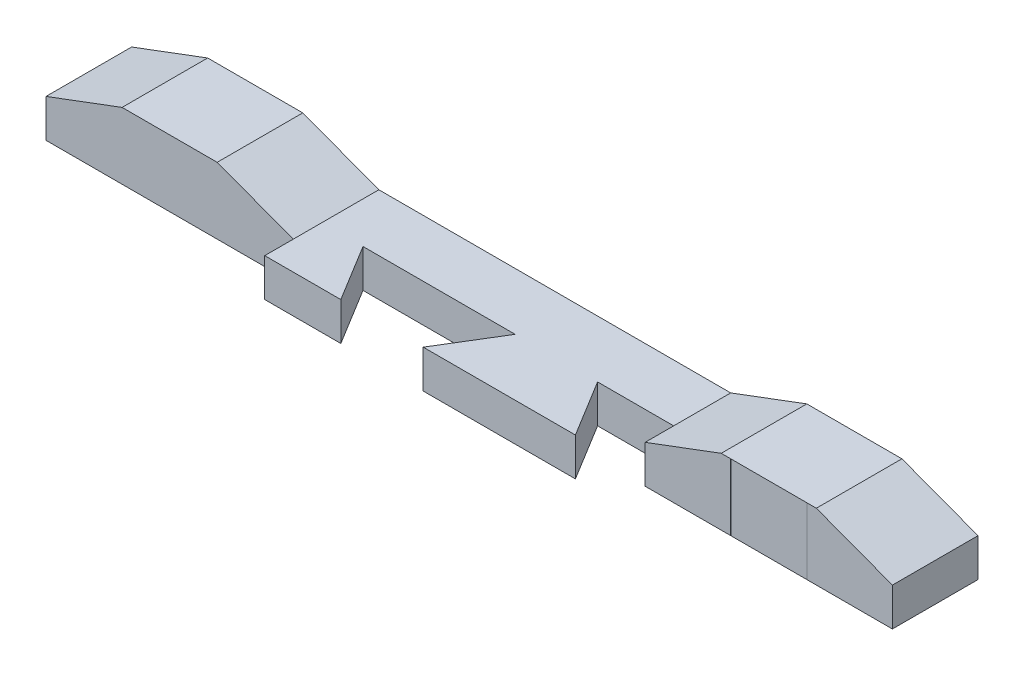
ISO-10303-21;
HEADER;
FILE_DESCRIPTION(('STEP AP214'),'2;1');
FILE_NAME('part.step','',(''),(''),'','','');
FILE_SCHEMA(('AUTOMOTIVE_DESIGN { 1 0 10303 214 1 1 1 1 }'));
ENDSEC;
DATA;
#1=APPLICATION_CONTEXT('core data for automotive mechanical design processes');
#2=APPLICATION_PROTOCOL_DEFINITION('international standard','automotive_design',2000,#1);
#3=PRODUCT_CONTEXT('',#1,'mechanical');
#4=PRODUCT('Part','Part','',(#3));
#5=PRODUCT_RELATED_PRODUCT_CATEGORY('part','',(#4));
#6=PRODUCT_DEFINITION_FORMATION('','',#4);
#7=PRODUCT_DEFINITION_CONTEXT('part definition',#1,'design');
#8=PRODUCT_DEFINITION('design','',#6,#7);
#9=PRODUCT_DEFINITION_SHAPE('','',#8);
#10=(LENGTH_UNIT() NAMED_UNIT(*) SI_UNIT(.MILLI.,.METRE.));
#11=(NAMED_UNIT(*) PLANE_ANGLE_UNIT() SI_UNIT($,.RADIAN.));
#12=(NAMED_UNIT(*) SI_UNIT($,.STERADIAN.) SOLID_ANGLE_UNIT());
#13=UNCERTAINTY_MEASURE_WITH_UNIT(LENGTH_MEASURE(1.E-05),#10,'distance_accuracy_value','');
#14=(GEOMETRIC_REPRESENTATION_CONTEXT(3) GLOBAL_UNCERTAINTY_ASSIGNED_CONTEXT((#13)) GLOBAL_UNIT_ASSIGNED_CONTEXT((#10,
#11,#12)) REPRESENTATION_CONTEXT('',''));
#15=CARTESIAN_POINT('',(0.,0.,0.));
#16=DIRECTION('',(0.,0.,1.));
#17=DIRECTION('',(1.,0.,0.));
#18=AXIS2_PLACEMENT_3D('',#15,#16,#17);
#19=CARTESIAN_POINT('',(0.,-3.50000000000008,4.));
#20=DIRECTION('',(0.,0.,1.));
#21=DIRECTION('',(1.,0.,0.));
#22=AXIS2_PLACEMENT_3D('',#19,#20,#21);
#23=PLANE('',#22);
#24=DIRECTION('',(0.,1.,0.));
#25=VECTOR('',#24,1.);
#26=CARTESIAN_POINT('',(35.4999999999999,-3.50000000000008,4.));
#27=LINE('',#26,#25);
#28=CARTESIAN_POINT('',(35.4999999999999,-3.50000000000008,4.));
#29=VERTEX_POINT('',#28);
#30=CARTESIAN_POINT('',(35.4999999999999,0.,4.));
#31=VERTEX_POINT('',#30);
#32=EDGE_CURVE('E209',#29,#31,#27,.T.);
#33=ORIENTED_EDGE('',*,*,#32,.F.);
#34=DIRECTION('',(1.,0.,0.));
#35=VECTOR('',#34,1.);
#36=CARTESIAN_POINT('',(0.,-3.50000000000008,4.));
#37=LINE('',#36,#35);
#38=CARTESIAN_POINT('',(40.,-3.50000000000008,4.));
#39=VERTEX_POINT('',#38);
#40=EDGE_CURVE('E255',#29,#39,#37,.T.);
#41=ORIENTED_EDGE('',*,*,#40,.T.);
#42=DIRECTION('',(0.,1.,0.));
#43=VECTOR('',#42,1.);
#44=CARTESIAN_POINT('',(40.,-3.50000000000008,4.));
#45=LINE('',#44,#43);
#46=CARTESIAN_POINT('',(40.,-1.50000000000008,4.));
#47=VERTEX_POINT('',#46);
#48=EDGE_CURVE('E282',#39,#47,#45,.T.);
#49=ORIENTED_EDGE('',*,*,#48,.T.);
#50=DIRECTION('',(-0.936329177569043,0.351123441588395,0.));
#51=VECTOR('',#50,1.);
#52=CARTESIAN_POINT('',(35.5616438356165,0.164383561643774,4.));
#53=LINE('',#52,#51);
#54=CARTESIAN_POINT('',(35.9999999999998,0.,4.));
#55=VERTEX_POINT('',#54);
#56=EDGE_CURVE('E286',#47,#55,#53,.T.);
#57=ORIENTED_EDGE('',*,*,#56,.T.);
#58=DIRECTION('',(1.,0.,0.));
#59=VECTOR('',#58,1.);
#60=CARTESIAN_POINT('',(0.,0.,4.));
#61=LINE('',#60,#59);
#62=EDGE_CURVE('E250',#31,#55,#61,.T.);
#63=ORIENTED_EDGE('',*,*,#62,.F.);
#64=EDGE_LOOP('',(#33,#41,#49,#57,#63));
#65=FACE_BOUND('',#64,.T.);
#66=ADVANCED_FACE('F40',(#65),#23,.T.);
#67=CARTESIAN_POINT('',(0.,0.,4.));
#68=DIRECTION('',(0.,-1.,0.));
#69=DIRECTION('',(1.,0.,0.));
#70=AXIS2_PLACEMENT_3D('',#67,#68,#69);
#71=PLANE('',#70);
#72=DIRECTION('',(1.,0.,0.));
#73=VECTOR('',#72,1.);
#74=CARTESIAN_POINT('',(0.,0.,4.));
#75=LINE('',#74,#73);
#76=CARTESIAN_POINT('',(-0.5,0.,4.));
#77=VERTEX_POINT('',#76);
#78=CARTESIAN_POINT('',(4.5,0.,4.));
#79=VERTEX_POINT('',#78);
#80=EDGE_CURVE('E252',#77,#79,#75,.T.);
#81=ORIENTED_EDGE('',*,*,#80,.T.);
#82=DIRECTION('',(0.,0.,-1.));
#83=VECTOR('',#82,1.);
#84=CARTESIAN_POINT('',(4.5,0.,4.));
#85=LINE('',#84,#83);
#86=CARTESIAN_POINT('',(4.5,0.,-0.5));
#87=VERTEX_POINT('',#86);
#88=EDGE_CURVE('E333',#79,#87,#85,.T.);
#89=ORIENTED_EDGE('',*,*,#88,.T.);
#90=DIRECTION('',(1.,0.,0.));
#91=VECTOR('',#90,1.);
#92=CARTESIAN_POINT('',(-0.5,0.,-0.5));
#93=LINE('',#92,#91);
#94=CARTESIAN_POINT('',(-0.5,0.,-0.5));
#95=VERTEX_POINT('',#94);
#96=EDGE_CURVE('E222',#95,#87,#93,.T.);
#97=ORIENTED_EDGE('',*,*,#96,.F.);
#98=DIRECTION('',(0.,0.,-1.));
#99=VECTOR('',#98,1.);
#100=CARTESIAN_POINT('',(-0.5,0.,4.));
#101=LINE('',#100,#99);
#102=EDGE_CURVE('E342',#77,#95,#101,.T.);
#103=ORIENTED_EDGE('',*,*,#102,.F.);
#104=EDGE_LOOP('',(#81,#89,#97,#103));
#105=FACE_BOUND('',#104,.T.);
#106=ADVANCED_FACE('F42',(#105),#71,.F.);
#107=CARTESIAN_POINT('',(-0.0616438356164384,0.164383561643836,4.));
#108=DIRECTION('',(0.351123441588392,-0.936329177569045,0.));
#109=DIRECTION('',(0.936329177569045,0.351123441588392,0.));
#110=AXIS2_PLACEMENT_3D('',#107,#108,#109);
#111=PLANE('',#110);
#112=DIRECTION('',(-0.936329177569045,-0.351123441588392,0.));
#113=VECTOR('',#112,1.);
#114=CARTESIAN_POINT('',(-0.0616438356164384,0.164383561643836,4.));
#115=LINE('',#114,#113);
#116=CARTESIAN_POINT('',(-4.5,-1.5,4.));
#117=VERTEX_POINT('',#116);
#118=EDGE_CURVE('E320',#77,#117,#115,.T.);
#119=ORIENTED_EDGE('',*,*,#118,.F.);
#120=ORIENTED_EDGE('',*,*,#102,.T.);
#121=DIRECTION('',(0.936329177569044,0.351123441588392,0.));
#122=VECTOR('',#121,1.);
#123=CARTESIAN_POINT('',(-4.5,-1.5,-0.5));
#124=LINE('',#123,#122);
#125=CARTESIAN_POINT('',(-4.5,-1.5,-0.5));
#126=VERTEX_POINT('',#125);
#127=EDGE_CURVE('E219',#126,#95,#124,.T.);
#128=ORIENTED_EDGE('',*,*,#127,.F.);
#129=DIRECTION('',(0.,0.,-1.));
#130=VECTOR('',#129,1.);
#131=CARTESIAN_POINT('',(-4.5,-1.5,4.));
#132=LINE('',#131,#130);
#133=EDGE_CURVE('E340',#117,#126,#132,.T.);
#134=ORIENTED_EDGE('',*,*,#133,.F.);
#135=EDGE_LOOP('',(#119,#120,#128,#134));
#136=FACE_BOUND('',#135,.T.);
#137=ADVANCED_FACE('F398',(#136),#111,.F.);
#138=CARTESIAN_POINT('',(-4.5,0.,4.));
#139=DIRECTION('',(-1.,0.,0.));
#140=DIRECTION('',(0.,-1.,0.));
#141=AXIS2_PLACEMENT_3D('',#138,#139,#140);
#142=PLANE('',#141);
#143=DIRECTION('',(0.,0.,-1.));
#144=VECTOR('',#143,1.);
#145=CARTESIAN_POINT('',(-4.5,-3.5,4.));
#146=LINE('',#145,#144);
#147=CARTESIAN_POINT('',(-4.5,-3.50000000000008,4.));
#148=VERTEX_POINT('',#147);
#149=CARTESIAN_POINT('',(-4.5,-3.5,-0.5));
#150=VERTEX_POINT('',#149);
#151=EDGE_CURVE('E338',#148,#150,#146,.T.);
#152=ORIENTED_EDGE('',*,*,#151,.F.);
#153=DIRECTION('',(0.,1.,0.));
#154=VECTOR('',#153,1.);
#155=CARTESIAN_POINT('',(-4.5,-3.50000000000008,4.));
#156=LINE('',#155,#154);
#157=EDGE_CURVE('E283',#148,#117,#156,.T.);
#158=ORIENTED_EDGE('',*,*,#157,.T.);
#159=ORIENTED_EDGE('',*,*,#133,.T.);
#160=DIRECTION('',(0.,1.,0.));
#161=VECTOR('',#160,1.);
#162=CARTESIAN_POINT('',(-4.5,-3.5,-0.5));
#163=LINE('',#162,#161);
#164=EDGE_CURVE('E247',#150,#126,#163,.T.);
#165=ORIENTED_EDGE('',*,*,#164,.F.);
#166=EDGE_LOOP('',(#152,#158,#159,#165));
#167=FACE_BOUND('',#166,.T.);
#168=ADVANCED_FACE('F401',(#167),#142,.T.);
#169=CARTESIAN_POINT('',(0.,-3.5,4.));
#170=DIRECTION('',(0.,-1.,0.));
#171=DIRECTION('',(1.,0.,0.));
#172=AXIS2_PLACEMENT_3D('',#169,#170,#171);
#173=PLANE('',#172);
#174=DIRECTION('',(0.,0.,1.));
#175=VECTOR('',#174,1.);
#176=CARTESIAN_POINT('',(35.4999999999999,-3.50000000000008,3.999));
#177=LINE('',#176,#175);
#178=CARTESIAN_POINT('',(35.4999999999999,-3.50000000000008,3.999));
#179=VERTEX_POINT('',#178);
#180=EDGE_CURVE('E214',#179,#29,#177,.T.);
#181=ORIENTED_EDGE('',*,*,#180,.F.);
#182=DIRECTION('',(1.,0.,0.));
#183=VECTOR('',#182,1.);
#184=CARTESIAN_POINT('',(31.4999999999999,-3.50000000000008,3.999));
#185=LINE('',#184,#183);
#186=CARTESIAN_POINT('',(31.4999999999999,-3.50000000000008,3.999));
#187=VERTEX_POINT('',#186);
#188=EDGE_CURVE('E199',#187,#179,#185,.T.);
#189=ORIENTED_EDGE('',*,*,#188,.F.);
#190=DIRECTION('',(0.,0.,1.));
#191=VECTOR('',#190,1.);
#192=CARTESIAN_POINT('',(31.4999999999999,-3.50000000000008,3.999));
#193=LINE('',#192,#191);
#194=CARTESIAN_POINT('',(31.4999999999999,-3.50000000000008,4.));
#195=VERTEX_POINT('',#194);
#196=EDGE_CURVE('E196',#187,#195,#193,.T.);
#197=ORIENTED_EDGE('',*,*,#196,.T.);
#198=CARTESIAN_POINT('',(27.,-3.50000000000008,4.));
#199=VERTEX_POINT('',#198);
#200=EDGE_CURVE('E256',#199,#195,#37,.T.);
#201=ORIENTED_EDGE('',*,*,#200,.F.);
#202=DIRECTION('',(0.,0.,-1.));
#203=VECTOR('',#202,1.);
#204=CARTESIAN_POINT('',(27.,-3.50000000000008,0.));
#205=LINE('',#204,#203);
#206=CARTESIAN_POINT('',(27.,-3.50000000000008,2.5));
#207=VERTEX_POINT('',#206);
#208=EDGE_CURVE('E259',#199,#207,#205,.T.);
#209=ORIENTED_EDGE('',*,*,#208,.T.);
#210=DIRECTION('',(1.,0.,0.));
#211=VECTOR('',#210,1.);
#212=CARTESIAN_POINT('',(0.,-3.50000000000008,2.5));
#213=LINE('',#212,#211);
#214=CARTESIAN_POINT('',(23.,-3.50000000000008,2.5));
#215=VERTEX_POINT('',#214);
#216=EDGE_CURVE('E262',#215,#207,#213,.T.);
#217=ORIENTED_EDGE('',*,*,#216,.F.);
#218=DIRECTION('',(-0.521450009453975,0.,-0.853281833651959));
#219=VECTOR('',#218,1.);
#220=CARTESIAN_POINT('',(15.6337078651685,-3.50000000000008,-9.55393258426966));
#221=LINE('',#220,#219);
#222=CARTESIAN_POINT('',(24.8333333333333,-3.50000000000008,5.5));
#223=VERTEX_POINT('',#222);
#224=EDGE_CURVE('E264',#223,#215,#221,.T.);
#225=ORIENTED_EDGE('',*,*,#224,.F.);
#226=DIRECTION('',(1.,0.,0.));
#227=VECTOR('',#226,1.);
#228=CARTESIAN_POINT('',(0.,-3.50000000000008,5.5));
#229=LINE('',#228,#227);
#230=CARTESIAN_POINT('',(16.8333333333333,-3.50000000000008,5.5));
#231=VERTEX_POINT('',#230);
#232=EDGE_CURVE('E266',#231,#223,#229,.T.);
#233=ORIENTED_EDGE('',*,*,#232,.F.);
#234=DIRECTION('',(-0.521450009453975,0.,0.853281833651959));
#235=VECTOR('',#234,1.);
#236=CARTESIAN_POINT('',(14.7033707865169,-3.50000000000008,8.98539325842696));
#237=LINE('',#236,#235);
#238=CARTESIAN_POINT('',(18.6666666666667,-3.50000000000008,2.5));
#239=VERTEX_POINT('',#238);
#240=EDGE_CURVE('E268',#239,#231,#237,.T.);
#241=ORIENTED_EDGE('',*,*,#240,.F.);
#242=DIRECTION('',(1.,0.,0.));
#243=VECTOR('',#242,1.);
#244=CARTESIAN_POINT('',(0.,-3.50000000000008,2.5));
#245=LINE('',#244,#243);
#246=CARTESIAN_POINT('',(10.6666666666667,-3.50000000000008,2.5));
#247=VERTEX_POINT('',#246);
#248=EDGE_CURVE('E270',#247,#239,#245,.T.);
#249=ORIENTED_EDGE('',*,*,#248,.F.);
#250=DIRECTION('',(0.521450009453975,0.,0.853281833651959));
#251=VECTOR('',#250,1.);
#252=CARTESIAN_POINT('',(6.65393258426967,-3.50000000000008,-4.06629213483146));
#253=LINE('',#252,#251);
#254=CARTESIAN_POINT('',(12.5,-3.50000000000008,5.5));
#255=VERTEX_POINT('',#254);
#256=EDGE_CURVE('E272',#247,#255,#253,.T.);
#257=ORIENTED_EDGE('',*,*,#256,.T.);
#258=DIRECTION('',(-1.,0.,0.));
#259=VECTOR('',#258,1.);
#260=CARTESIAN_POINT('',(0.,-3.50000000000008,5.5));
#261=LINE('',#260,#259);
#262=CARTESIAN_POINT('',(8.5,-3.50000000000008,5.5));
#263=VERTEX_POINT('',#262);
#264=EDGE_CURVE('E275',#255,#263,#261,.T.);
#265=ORIENTED_EDGE('',*,*,#264,.T.);
#266=DIRECTION('',(0.,0.,1.));
#267=VECTOR('',#266,1.);
#268=CARTESIAN_POINT('',(8.5,-3.50000000000008,0.));
#269=LINE('',#268,#267);
#270=CARTESIAN_POINT('',(8.5,-3.50000000000008,4.));
#271=VERTEX_POINT('',#270);
#272=EDGE_CURVE('E278',#271,#263,#269,.T.);
#273=ORIENTED_EDGE('',*,*,#272,.F.);
#274=DIRECTION('',(1.,0.,0.));
#275=VECTOR('',#274,1.);
#276=CARTESIAN_POINT('',(0.,-3.50000000000008,4.));
#277=LINE('',#276,#275);
#278=EDGE_CURVE('E280',#148,#271,#277,.T.);
#279=ORIENTED_EDGE('',*,*,#278,.F.);
#280=ORIENTED_EDGE('',*,*,#151,.T.);
#281=DIRECTION('',(-1.,0.,0.));
#282=VECTOR('',#281,1.);
#283=CARTESIAN_POINT('',(40.,-3.50000000000008,-0.5));
#284=LINE('',#283,#282);
#285=CARTESIAN_POINT('',(40.,-3.50000000000008,-0.5));
#286=VERTEX_POINT('',#285);
#287=EDGE_CURVE('E244',#286,#150,#284,.T.);
#288=ORIENTED_EDGE('',*,*,#287,.F.);
#289=DIRECTION('',(0.,0.,-1.));
#290=VECTOR('',#289,1.);
#291=CARTESIAN_POINT('',(40.,-3.50000000000008,4.));
#292=LINE('',#291,#290);
#293=EDGE_CURVE('E327',#39,#286,#292,.T.);
#294=ORIENTED_EDGE('',*,*,#293,.F.);
#295=ORIENTED_EDGE('',*,*,#40,.F.);
#296=EDGE_LOOP('',(#181,#189,#197,#201,#209,#217,#225,#233,#241,#249,#257,#265,#273,#279,#280,
#288,#294,#295));
#297=FACE_BOUND('',#296,.T.);
#298=ADVANCED_FACE('F405',(#297),#173,.T.);
#299=CARTESIAN_POINT('',(0.554794520547946,1.47945205479452,4.));
#300=DIRECTION('',(0.351123441588392,0.936329177569045,0.));
#301=DIRECTION('',(-0.936329177569045,0.351123441588392,0.));
#302=AXIS2_PLACEMENT_3D('',#299,#300,#301);
#303=PLANE('',#302);
#304=ORIENTED_EDGE('',*,*,#88,.F.);
#305=DIRECTION('',(0.936329177569045,-0.351123441588392,0.));
#306=VECTOR('',#305,1.);
#307=CARTESIAN_POINT('',(0.554794520547946,1.47945205479452,4.));
#308=LINE('',#307,#306);
#309=CARTESIAN_POINT('',(8.5,-1.5,4.));
#310=VERTEX_POINT('',#309);
#311=EDGE_CURVE('E346',#79,#310,#308,.T.);
#312=ORIENTED_EDGE('',*,*,#311,.T.);
#313=DIRECTION('',(0.,0.,-1.));
#314=VECTOR('',#313,1.);
#315=CARTESIAN_POINT('',(8.5,-1.5,4.));
#316=LINE('',#315,#314);
#317=CARTESIAN_POINT('',(8.5,-1.5,-0.5));
#318=VERTEX_POINT('',#317);
#319=EDGE_CURVE('E335',#310,#318,#316,.T.);
#320=ORIENTED_EDGE('',*,*,#319,.T.);
#321=DIRECTION('',(0.936329177569045,-0.351123441588392,0.));
#322=VECTOR('',#321,1.);
#323=CARTESIAN_POINT('',(4.5,0.,-0.5));
#324=LINE('',#323,#322);
#325=EDGE_CURVE('E226',#87,#318,#324,.T.);
#326=ORIENTED_EDGE('',*,*,#325,.F.);
#327=EDGE_LOOP('',(#304,#312,#320,#326));
#328=FACE_BOUND('',#327,.T.);
#329=ADVANCED_FACE('F386',(#328),#303,.T.);
#330=CARTESIAN_POINT('',(35.5,0.,4.));
#331=DIRECTION('',(0.,-1.,0.));
#332=DIRECTION('',(-1.,0.,0.));
#333=AXIS2_PLACEMENT_3D('',#330,#331,#332);
#334=PLANE('',#333);
#335=DIRECTION('',(-1.,0.,0.));
#336=VECTOR('',#335,1.);
#337=CARTESIAN_POINT('',(35.4999999999999,0.,3.999));
#338=LINE('',#337,#336);
#339=CARTESIAN_POINT('',(35.4999999999999,0.,3.999));
#340=VERTEX_POINT('',#339);
#341=CARTESIAN_POINT('',(31.4999999999999,0.,3.999));
#342=VERTEX_POINT('',#341);
#343=EDGE_CURVE('E200',#340,#342,#338,.T.);
#344=ORIENTED_EDGE('',*,*,#343,.F.);
#345=DIRECTION('',(0.,0.,1.));
#346=VECTOR('',#345,1.);
#347=CARTESIAN_POINT('',(35.4999999999999,0.,3.999));
#348=LINE('',#347,#346);
#349=EDGE_CURVE('E223',#340,#31,#348,.T.);
#350=ORIENTED_EDGE('',*,*,#349,.T.);
#351=ORIENTED_EDGE('',*,*,#62,.T.);
#352=DIRECTION('',(0.,0.,-1.));
#353=VECTOR('',#352,1.);
#354=CARTESIAN_POINT('',(36.,0.,4.));
#355=LINE('',#354,#353);
#356=CARTESIAN_POINT('',(36.,0.,-0.5));
#357=VERTEX_POINT('',#356);
#358=EDGE_CURVE('E331',#55,#357,#355,.T.);
#359=ORIENTED_EDGE('',*,*,#358,.T.);
#360=DIRECTION('',(1.,0.,0.));
#361=VECTOR('',#360,1.);
#362=CARTESIAN_POINT('',(31.,0.,-0.5));
#363=LINE('',#362,#361);
#364=CARTESIAN_POINT('',(31.,0.,-0.5));
#365=VERTEX_POINT('',#364);
#366=EDGE_CURVE('E235',#365,#357,#363,.T.);
#367=ORIENTED_EDGE('',*,*,#366,.F.);
#368=DIRECTION('',(0.,0.,-1.));
#369=VECTOR('',#368,1.);
#370=CARTESIAN_POINT('',(31.,0.,4.));
#371=LINE('',#370,#369);
#372=CARTESIAN_POINT('',(31.,0.,4.));
#373=VERTEX_POINT('',#372);
#374=EDGE_CURVE('E322',#373,#365,#371,.T.);
#375=ORIENTED_EDGE('',*,*,#374,.F.);
#376=CARTESIAN_POINT('',(31.4999999999999,0.,4.));
#377=VERTEX_POINT('',#376);
#378=EDGE_CURVE('E62',#373,#377,#61,.T.);
#379=ORIENTED_EDGE('',*,*,#378,.T.);
#380=DIRECTION('',(0.,0.,1.));
#381=VECTOR('',#380,1.);
#382=CARTESIAN_POINT('',(31.4999999999999,0.,3.999));
#383=LINE('',#382,#381);
#384=EDGE_CURVE('E55',#342,#377,#383,.T.);
#385=ORIENTED_EDGE('',*,*,#384,.F.);
#386=EDGE_LOOP('',(#344,#350,#351,#359,#367,#375,#379,#385));
#387=FACE_BOUND('',#386,.T.);
#388=ADVANCED_FACE('F211',(#387),#334,.F.);
#389=CARTESIAN_POINT('',(35.5616438356165,0.164383561643774,4.));
#390=DIRECTION('',(-0.351123441588395,-0.936329177569043,0.));
#391=DIRECTION('',(-0.936329177569043,0.351123441588395,0.));
#392=AXIS2_PLACEMENT_3D('',#389,#390,#391);
#393=PLANE('',#392);
#394=ORIENTED_EDGE('',*,*,#56,.F.);
#395=DIRECTION('',(0.,0.,-1.));
#396=VECTOR('',#395,1.);
#397=CARTESIAN_POINT('',(40.,-1.50000000000008,4.));
#398=LINE('',#397,#396);
#399=CARTESIAN_POINT('',(40.,-1.50000000000008,-0.5));
#400=VERTEX_POINT('',#399);
#401=EDGE_CURVE('E329',#47,#400,#398,.T.);
#402=ORIENTED_EDGE('',*,*,#401,.T.);
#403=DIRECTION('',(0.936329177569043,-0.351123441588395,0.));
#404=VECTOR('',#403,1.);
#405=CARTESIAN_POINT('',(36.,0.,-0.5));
#406=LINE('',#405,#404);
#407=EDGE_CURVE('E238',#357,#400,#406,.T.);
#408=ORIENTED_EDGE('',*,*,#407,.F.);
#409=ORIENTED_EDGE('',*,*,#358,.F.);
#410=EDGE_LOOP('',(#394,#402,#408,#409));
#411=FACE_BOUND('',#410,.T.);
#412=ADVANCED_FACE('F427',(#411),#393,.F.);
#413=CARTESIAN_POINT('',(40.,0.,4.));
#414=DIRECTION('',(1.,0.,0.));
#415=DIRECTION('',(0.,-1.,0.));
#416=AXIS2_PLACEMENT_3D('',#413,#414,#415);
#417=PLANE('',#416);
#418=ORIENTED_EDGE('',*,*,#401,.F.);
#419=ORIENTED_EDGE('',*,*,#48,.F.);
#420=ORIENTED_EDGE('',*,*,#293,.T.);
#421=DIRECTION('',(0.,-1.,0.));
#422=VECTOR('',#421,1.);
#423=CARTESIAN_POINT('',(40.,-1.50000000000008,-0.5));
#424=LINE('',#423,#422);
#425=EDGE_CURVE('E241',#400,#286,#424,.T.);
#426=ORIENTED_EDGE('',*,*,#425,.F.);
#427=EDGE_LOOP('',(#418,#419,#420,#426));
#428=FACE_BOUND('',#427,.T.);
#429=ADVANCED_FACE('F411',(#428),#417,.T.);
#430=CARTESIAN_POINT('',(34.9452054794521,1.47945205479446,4.));
#431=DIRECTION('',(-0.351123441588389,0.936329177569046,0.));
#432=DIRECTION('',(0.936329177569046,0.351123441588389,0.));
#433=AXIS2_PLACEMENT_3D('',#430,#431,#432);
#434=PLANE('',#433);
#435=DIRECTION('',(0.,0.,-1.));
#436=VECTOR('',#435,1.);
#437=CARTESIAN_POINT('',(27.,-1.50000000000003,4.));
#438=LINE('',#437,#436);
#439=CARTESIAN_POINT('',(27.,-1.50000000000003,4.));
#440=VERTEX_POINT('',#439);
#441=CARTESIAN_POINT('',(27.,-1.50000000000003,2.5));
#442=VERTEX_POINT('',#441);
#443=EDGE_CURVE('E326',#440,#442,#438,.T.);
#444=ORIENTED_EDGE('',*,*,#443,.F.);
#445=DIRECTION('',(0.936329177569046,0.351123441588389,0.));
#446=VECTOR('',#445,1.);
#447=CARTESIAN_POINT('',(34.9452054794521,1.47945205479446,4.));
#448=LINE('',#447,#446);
#449=EDGE_CURVE('E344',#440,#373,#448,.T.);
#450=ORIENTED_EDGE('',*,*,#449,.T.);
#451=ORIENTED_EDGE('',*,*,#374,.T.);
#452=DIRECTION('',(0.936329177569046,0.351123441588388,0.));
#453=VECTOR('',#452,1.);
#454=CARTESIAN_POINT('',(27.,-1.50000000000003,-0.5));
#455=LINE('',#454,#453);
#456=CARTESIAN_POINT('',(27.,-1.50000000000003,-0.5));
#457=VERTEX_POINT('',#456);
#458=EDGE_CURVE('E232',#457,#365,#455,.T.);
#459=ORIENTED_EDGE('',*,*,#458,.F.);
#460=EDGE_CURVE('E324',#442,#457,#438,.T.);
#461=ORIENTED_EDGE('',*,*,#460,.F.);
#462=EDGE_LOOP('',(#444,#450,#451,#459,#461));
#463=FACE_BOUND('',#462,.T.);
#464=ADVANCED_FACE('F434',(#463),#434,.T.);
#465=CARTESIAN_POINT('',(0.,-1.5,4.));
#466=DIRECTION('',(0.,1.,0.));
#467=DIRECTION('',(0.,0.,1.));
#468=AXIS2_PLACEMENT_3D('',#465,#466,#467);
#469=PLANE('',#468);
#470=DIRECTION('',(-1.,0.,0.));
#471=VECTOR('',#470,1.);
#472=CARTESIAN_POINT('',(0.,-1.5,5.5));
#473=LINE('',#472,#471);
#474=CARTESIAN_POINT('',(12.5,-1.5,5.5));
#475=VERTEX_POINT('',#474);
#476=CARTESIAN_POINT('',(8.5,-1.5,5.5));
#477=VERTEX_POINT('',#476);
#478=EDGE_CURVE('E11',#475,#477,#473,.T.);
#479=ORIENTED_EDGE('',*,*,#478,.F.);
#480=DIRECTION('',(0.521450009453975,0.,0.853281833651959));
#481=VECTOR('',#480,1.);
#482=CARTESIAN_POINT('',(8.43370786516854,-1.5,-1.15393258426966));
#483=LINE('',#482,#481);
#484=CARTESIAN_POINT('',(10.6666666666667,-1.5,2.5));
#485=VERTEX_POINT('',#484);
#486=EDGE_CURVE('E48',#485,#475,#483,.T.);
#487=ORIENTED_EDGE('',*,*,#486,.F.);
#488=DIRECTION('',(1.,0.,0.));
#489=VECTOR('',#488,1.);
#490=CARTESIAN_POINT('',(0.,-1.5,2.5));
#491=LINE('',#490,#489);
#492=CARTESIAN_POINT('',(18.6666666666667,-1.5,2.5));
#493=VERTEX_POINT('',#492);
#494=EDGE_CURVE('E361',#485,#493,#491,.T.);
#495=ORIENTED_EDGE('',*,*,#494,.T.);
#496=DIRECTION('',(-0.521450009453975,0.,0.853281833651959));
#497=VECTOR('',#496,1.);
#498=CARTESIAN_POINT('',(12.923595505618,-1.5,11.8977528089888));
#499=LINE('',#498,#497);
#500=CARTESIAN_POINT('',(16.8333333333333,-1.5,5.5));
#501=VERTEX_POINT('',#500);
#502=EDGE_CURVE('E358',#493,#501,#499,.T.);
#503=ORIENTED_EDGE('',*,*,#502,.T.);
#504=DIRECTION('',(1.,0.,0.));
#505=VECTOR('',#504,1.);
#506=CARTESIAN_POINT('',(0.,-1.5,5.5));
#507=LINE('',#506,#505);
#508=CARTESIAN_POINT('',(24.8333333333333,-1.5,5.5));
#509=VERTEX_POINT('',#508);
#510=EDGE_CURVE('E355',#501,#509,#507,.T.);
#511=ORIENTED_EDGE('',*,*,#510,.T.);
#512=DIRECTION('',(-0.521450009453975,0.,-0.853281833651959));
#513=VECTOR('',#512,1.);
#514=CARTESIAN_POINT('',(17.4134831460674,-1.5,-6.64157303370786));
#515=LINE('',#514,#513);
#516=CARTESIAN_POINT('',(23.,-1.5,2.5));
#517=VERTEX_POINT('',#516);
#518=EDGE_CURVE('E352',#509,#517,#515,.T.);
#519=ORIENTED_EDGE('',*,*,#518,.T.);
#520=DIRECTION('',(1.,0.,0.));
#521=VECTOR('',#520,1.);
#522=CARTESIAN_POINT('',(0.,-1.5,2.5));
#523=LINE('',#522,#521);
#524=EDGE_CURVE('E349',#517,#442,#523,.T.);
#525=ORIENTED_EDGE('',*,*,#524,.T.);
#526=ORIENTED_EDGE('',*,*,#460,.T.);
#527=DIRECTION('',(1.,0.,0.));
#528=VECTOR('',#527,1.);
#529=CARTESIAN_POINT('',(8.5,-1.5,-0.5));
#530=LINE('',#529,#528);
#531=EDGE_CURVE('E229',#318,#457,#530,.T.);
#532=ORIENTED_EDGE('',*,*,#531,.F.);
#533=ORIENTED_EDGE('',*,*,#319,.F.);
#534=EDGE_CURVE('E337',#477,#310,#316,.T.);
#535=ORIENTED_EDGE('',*,*,#534,.F.);
#536=EDGE_LOOP('',(#479,#487,#495,#503,#511,#519,#525,#526,#532,#533,#535));
#537=FACE_BOUND('',#536,.T.);
#538=ADVANCED_FACE('F374',(#537),#469,.T.);
#539=CARTESIAN_POINT('',(0.,-3.50000000000008,4.));
#540=DIRECTION('',(0.,0.,1.));
#541=DIRECTION('',(1.,0.,0.));
#542=AXIS2_PLACEMENT_3D('',#539,#540,#541);
#543=PLANE('',#542);
#544=ORIENTED_EDGE('',*,*,#118,.T.);
#545=ORIENTED_EDGE('',*,*,#157,.F.);
#546=ORIENTED_EDGE('',*,*,#278,.T.);
#547=DIRECTION('',(0.,1.,0.));
#548=VECTOR('',#547,1.);
#549=CARTESIAN_POINT('',(8.5,-3.50000000000008,4.));
#550=LINE('',#549,#548);
#551=EDGE_CURVE('E287',#271,#310,#550,.T.);
#552=ORIENTED_EDGE('',*,*,#551,.T.);
#553=ORIENTED_EDGE('',*,*,#311,.F.);
#554=ORIENTED_EDGE('',*,*,#80,.F.);
#555=EDGE_LOOP('',(#544,#545,#546,#552,#553,#554));
#556=FACE_BOUND('',#555,.T.);
#557=ADVANCED_FACE('F382',(#556),#543,.T.);
#558=DIRECTION('',(0.,-1.,0.));
#559=VECTOR('',#558,1.);
#560=CARTESIAN_POINT('',(31.4999999999999,0.,4.));
#561=LINE('',#560,#559);
#562=EDGE_CURVE('E419',#377,#195,#561,.T.);
#563=ORIENTED_EDGE('',*,*,#562,.F.);
#564=ORIENTED_EDGE('',*,*,#378,.F.);
#565=ORIENTED_EDGE('',*,*,#449,.F.);
#566=DIRECTION('',(0.,1.,0.));
#567=VECTOR('',#566,1.);
#568=CARTESIAN_POINT('',(27.,-3.50000000000008,4.));
#569=LINE('',#568,#567);
#570=EDGE_CURVE('E314',#199,#440,#569,.T.);
#571=ORIENTED_EDGE('',*,*,#570,.F.);
#572=ORIENTED_EDGE('',*,*,#200,.T.);
#573=EDGE_LOOP('',(#563,#564,#565,#571,#572));
#574=FACE_BOUND('',#573,.T.);
#575=ADVANCED_FACE('F440',(#574),#23,.T.);
#576=CARTESIAN_POINT('',(8.5,-3.50000000000008,0.));
#577=DIRECTION('',(-1.,0.,0.));
#578=DIRECTION('',(0.,0.,1.));
#579=AXIS2_PLACEMENT_3D('',#576,#577,#578);
#580=PLANE('',#579);
#581=ORIENTED_EDGE('',*,*,#551,.F.);
#582=ORIENTED_EDGE('',*,*,#272,.T.);
#583=DIRECTION('',(0.,1.,0.));
#584=VECTOR('',#583,1.);
#585=CARTESIAN_POINT('',(8.5,-3.50000000000008,5.5));
#586=LINE('',#585,#584);
#587=EDGE_CURVE('E290',#263,#477,#586,.T.);
#588=ORIENTED_EDGE('',*,*,#587,.T.);
#589=ORIENTED_EDGE('',*,*,#534,.T.);
#590=EDGE_LOOP('',(#581,#582,#588,#589));
#591=FACE_BOUND('',#590,.T.);
#592=ADVANCED_FACE('F379',(#591),#580,.T.);
#593=CARTESIAN_POINT('',(0.,-3.50000000000008,5.5));
#594=DIRECTION('',(0.,0.,-1.));
#595=DIRECTION('',(-1.,0.,0.));
#596=AXIS2_PLACEMENT_3D('',#593,#594,#595);
#597=PLANE('',#596);
#598=ORIENTED_EDGE('',*,*,#478,.T.);
#599=ORIENTED_EDGE('',*,*,#587,.F.);
#600=ORIENTED_EDGE('',*,*,#264,.F.);
#601=DIRECTION('',(0.,1.,0.));
#602=VECTOR('',#601,1.);
#603=CARTESIAN_POINT('',(12.5,-3.50000000000008,5.5));
#604=LINE('',#603,#602);
#605=EDGE_CURVE('E293',#255,#475,#604,.T.);
#606=ORIENTED_EDGE('',*,*,#605,.T.);
#607=EDGE_LOOP('',(#598,#599,#600,#606));
#608=FACE_BOUND('',#607,.T.);
#609=ADVANCED_FACE('F371',(#608),#597,.F.);
#610=CARTESIAN_POINT('',(6.65393258426967,-3.50000000000008,-4.06629213483146));
#611=DIRECTION('',(-0.853281833651959,0.,0.521450009453975));
#612=DIRECTION('',(0.521450009453975,0.,0.853281833651959));
#613=AXIS2_PLACEMENT_3D('',#610,#611,#612);
#614=PLANE('',#613);
#615=ORIENTED_EDGE('',*,*,#486,.T.);
#616=ORIENTED_EDGE('',*,*,#605,.F.);
#617=ORIENTED_EDGE('',*,*,#256,.F.);
#618=DIRECTION('',(0.,1.,0.));
#619=VECTOR('',#618,1.);
#620=CARTESIAN_POINT('',(10.6666666666667,-3.50000000000008,2.5));
#621=LINE('',#620,#619);
#622=EDGE_CURVE('E296',#247,#485,#621,.T.);
#623=ORIENTED_EDGE('',*,*,#622,.T.);
#624=EDGE_LOOP('',(#615,#616,#617,#623));
#625=FACE_BOUND('',#624,.T.);
#626=ADVANCED_FACE('F365',(#625),#614,.F.);
#627=CARTESIAN_POINT('',(0.,-3.50000000000008,2.5));
#628=DIRECTION('',(0.,0.,1.));
#629=DIRECTION('',(1.,0.,0.));
#630=AXIS2_PLACEMENT_3D('',#627,#628,#629);
#631=PLANE('',#630);
#632=ORIENTED_EDGE('',*,*,#622,.F.);
#633=ORIENTED_EDGE('',*,*,#248,.T.);
#634=DIRECTION('',(0.,1.,0.));
#635=VECTOR('',#634,1.);
#636=CARTESIAN_POINT('',(18.6666666666667,-3.50000000000008,2.5));
#637=LINE('',#636,#635);
#638=EDGE_CURVE('E299',#239,#493,#637,.T.);
#639=ORIENTED_EDGE('',*,*,#638,.T.);
#640=ORIENTED_EDGE('',*,*,#494,.F.);
#641=EDGE_LOOP('',(#632,#633,#639,#640));
#642=FACE_BOUND('',#641,.T.);
#643=ADVANCED_FACE('F598',(#642),#631,.T.);
#644=CARTESIAN_POINT('',(14.7033707865169,-3.50000000000008,8.98539325842696));
#645=DIRECTION('',(-0.853281833651959,0.,-0.521450009453975));
#646=DIRECTION('',(-0.521450009453975,0.,0.853281833651959));
#647=AXIS2_PLACEMENT_3D('',#644,#645,#646);
#648=PLANE('',#647);
#649=ORIENTED_EDGE('',*,*,#638,.F.);
#650=ORIENTED_EDGE('',*,*,#240,.T.);
#651=DIRECTION('',(0.,1.,0.));
#652=VECTOR('',#651,1.);
#653=CARTESIAN_POINT('',(16.8333333333333,-3.50000000000008,5.5));
#654=LINE('',#653,#652);
#655=EDGE_CURVE('E302',#231,#501,#654,.T.);
#656=ORIENTED_EDGE('',*,*,#655,.T.);
#657=ORIENTED_EDGE('',*,*,#502,.F.);
#658=EDGE_LOOP('',(#649,#650,#656,#657));
#659=FACE_BOUND('',#658,.T.);
#660=ADVANCED_FACE('F601',(#659),#648,.T.);
#661=CARTESIAN_POINT('',(0.,-3.50000000000008,5.5));
#662=DIRECTION('',(0.,0.,1.));
#663=DIRECTION('',(1.,0.,0.));
#664=AXIS2_PLACEMENT_3D('',#661,#662,#663);
#665=PLANE('',#664);
#666=ORIENTED_EDGE('',*,*,#655,.F.);
#667=ORIENTED_EDGE('',*,*,#232,.T.);
#668=DIRECTION('',(0.,1.,0.));
#669=VECTOR('',#668,1.);
#670=CARTESIAN_POINT('',(24.8333333333333,-3.50000000000008,5.5));
#671=LINE('',#670,#669);
#672=EDGE_CURVE('E305',#223,#509,#671,.T.);
#673=ORIENTED_EDGE('',*,*,#672,.T.);
#674=ORIENTED_EDGE('',*,*,#510,.F.);
#675=EDGE_LOOP('',(#666,#667,#673,#674));
#676=FACE_BOUND('',#675,.T.);
#677=ADVANCED_FACE('F605',(#676),#665,.T.);
#678=CARTESIAN_POINT('',(15.6337078651685,-3.50000000000008,-9.55393258426966));
#679=DIRECTION('',(0.853281833651959,0.,-0.521450009453975));
#680=DIRECTION('',(-0.521450009453975,0.,-0.853281833651959));
#681=AXIS2_PLACEMENT_3D('',#678,#679,#680);
#682=PLANE('',#681);
#683=ORIENTED_EDGE('',*,*,#672,.F.);
#684=ORIENTED_EDGE('',*,*,#224,.T.);
#685=DIRECTION('',(0.,1.,0.));
#686=VECTOR('',#685,1.);
#687=CARTESIAN_POINT('',(23.,-3.50000000000008,2.5));
#688=LINE('',#687,#686);
#689=EDGE_CURVE('E308',#215,#517,#688,.T.);
#690=ORIENTED_EDGE('',*,*,#689,.T.);
#691=ORIENTED_EDGE('',*,*,#518,.F.);
#692=EDGE_LOOP('',(#683,#684,#690,#691));
#693=FACE_BOUND('',#692,.T.);
#694=ADVANCED_FACE('F609',(#693),#682,.T.);
#695=CARTESIAN_POINT('',(0.,-3.50000000000008,2.5));
#696=DIRECTION('',(0.,0.,1.));
#697=DIRECTION('',(1.,0.,0.));
#698=AXIS2_PLACEMENT_3D('',#695,#696,#697);
#699=PLANE('',#698);
#700=ORIENTED_EDGE('',*,*,#689,.F.);
#701=ORIENTED_EDGE('',*,*,#216,.T.);
#702=DIRECTION('',(0.,1.,0.));
#703=VECTOR('',#702,1.);
#704=CARTESIAN_POINT('',(27.,-3.50000000000008,2.5));
#705=LINE('',#704,#703);
#706=EDGE_CURVE('E311',#207,#442,#705,.T.);
#707=ORIENTED_EDGE('',*,*,#706,.T.);
#708=ORIENTED_EDGE('',*,*,#524,.F.);
#709=EDGE_LOOP('',(#700,#701,#707,#708));
#710=FACE_BOUND('',#709,.T.);
#711=ADVANCED_FACE('F467',(#710),#699,.T.);
#712=CARTESIAN_POINT('',(27.,-3.50000000000008,0.));
#713=DIRECTION('',(1.,0.,0.));
#714=DIRECTION('',(0.,0.,-1.));
#715=AXIS2_PLACEMENT_3D('',#712,#713,#714);
#716=PLANE('',#715);
#717=ORIENTED_EDGE('',*,*,#443,.T.);
#718=ORIENTED_EDGE('',*,*,#706,.F.);
#719=ORIENTED_EDGE('',*,*,#208,.F.);
#720=ORIENTED_EDGE('',*,*,#570,.T.);
#721=EDGE_LOOP('',(#717,#718,#719,#720));
#722=FACE_BOUND('',#721,.T.);
#723=ADVANCED_FACE('F463',(#722),#716,.F.);
#724=CARTESIAN_POINT('',(0.,0.,-0.5));
#725=DIRECTION('',(0.,0.,-1.));
#726=DIRECTION('',(-1.,0.,0.));
#727=AXIS2_PLACEMENT_3D('',#724,#725,#726);
#728=PLANE('',#727);
#729=ORIENTED_EDGE('',*,*,#127,.T.);
#730=ORIENTED_EDGE('',*,*,#96,.T.);
#731=ORIENTED_EDGE('',*,*,#325,.T.);
#732=ORIENTED_EDGE('',*,*,#531,.T.);
#733=ORIENTED_EDGE('',*,*,#458,.T.);
#734=ORIENTED_EDGE('',*,*,#366,.T.);
#735=ORIENTED_EDGE('',*,*,#407,.T.);
#736=ORIENTED_EDGE('',*,*,#425,.T.);
#737=ORIENTED_EDGE('',*,*,#287,.T.);
#738=ORIENTED_EDGE('',*,*,#164,.T.);
#739=EDGE_LOOP('',(#729,#730,#731,#732,#733,#734,#735,#736,#737,#738));
#740=FACE_BOUND('',#739,.T.);
#741=ADVANCED_FACE('F392',(#740),#728,.T.);
#742=CARTESIAN_POINT('',(35.4999999999999,-3.50000000000008,3.999));
#743=DIRECTION('',(1.,0.,0.));
#744=DIRECTION('',(0.,0.,-1.));
#745=AXIS2_PLACEMENT_3D('',#742,#743,#744);
#746=PLANE('',#745);
#747=ORIENTED_EDGE('',*,*,#32,.T.);
#748=ORIENTED_EDGE('',*,*,#349,.F.);
#749=DIRECTION('',(0.,1.,0.));
#750=VECTOR('',#749,1.);
#751=CARTESIAN_POINT('',(35.4999999999999,-3.50000000000008,3.999));
#752=LINE('',#751,#750);
#753=EDGE_CURVE('E206',#179,#340,#752,.T.);
#754=ORIENTED_EDGE('',*,*,#753,.F.);
#755=ORIENTED_EDGE('',*,*,#180,.T.);
#756=EDGE_LOOP('',(#747,#748,#754,#755));
#757=FACE_BOUND('',#756,.T.);
#758=ADVANCED_FACE('F423',(#757),#746,.F.);
#759=CARTESIAN_POINT('',(31.4999999999999,0.,3.999));
#760=DIRECTION('',(-1.,0.,0.));
#761=DIRECTION('',(0.,0.,1.));
#762=AXIS2_PLACEMENT_3D('',#759,#760,#761);
#763=PLANE('',#762);
#764=ORIENTED_EDGE('',*,*,#562,.T.);
#765=ORIENTED_EDGE('',*,*,#196,.F.);
#766=DIRECTION('',(0.,-1.,0.));
#767=VECTOR('',#766,1.);
#768=CARTESIAN_POINT('',(31.4999999999999,0.,3.999));
#769=LINE('',#768,#767);
#770=EDGE_CURVE('E192',#342,#187,#769,.T.);
#771=ORIENTED_EDGE('',*,*,#770,.F.);
#772=ORIENTED_EDGE('',*,*,#384,.T.);
#773=EDGE_LOOP('',(#764,#765,#771,#772));
#774=FACE_BOUND('',#773,.T.);
#775=ADVANCED_FACE('F194',(#774),#763,.F.);
#776=CARTESIAN_POINT('',(0.,0.,3.999));
#777=DIRECTION('',(0.,0.,1.));
#778=DIRECTION('',(1.,0.,0.));
#779=AXIS2_PLACEMENT_3D('',#776,#777,#778);
#780=PLANE('',#779);
#781=ORIENTED_EDGE('',*,*,#343,.T.);
#782=ORIENTED_EDGE('',*,*,#770,.T.);
#783=ORIENTED_EDGE('',*,*,#188,.T.);
#784=ORIENTED_EDGE('',*,*,#753,.T.);
#785=EDGE_LOOP('',(#781,#782,#783,#784));
#786=FACE_BOUND('',#785,.T.);
#787=ADVANCED_FACE('F204',(#786),#780,.T.);
#788=CLOSED_SHELL('',(#66,#106,#137,#168,#298,#329,#388,#412,#429,#464,#538,#557,#575,#592,#609,
#626,#643,#660,#677,#694,#711,#723,#741,#758,#775,#787));
#789=MANIFOLD_SOLID_BREP('B2',#788);
#790=ADVANCED_BREP_SHAPE_REPRESENTATION('',(#18,#789),#14);
#791=SHAPE_DEFINITION_REPRESENTATION(#9,#790);
ENDSEC;
END-ISO-10303-21;
